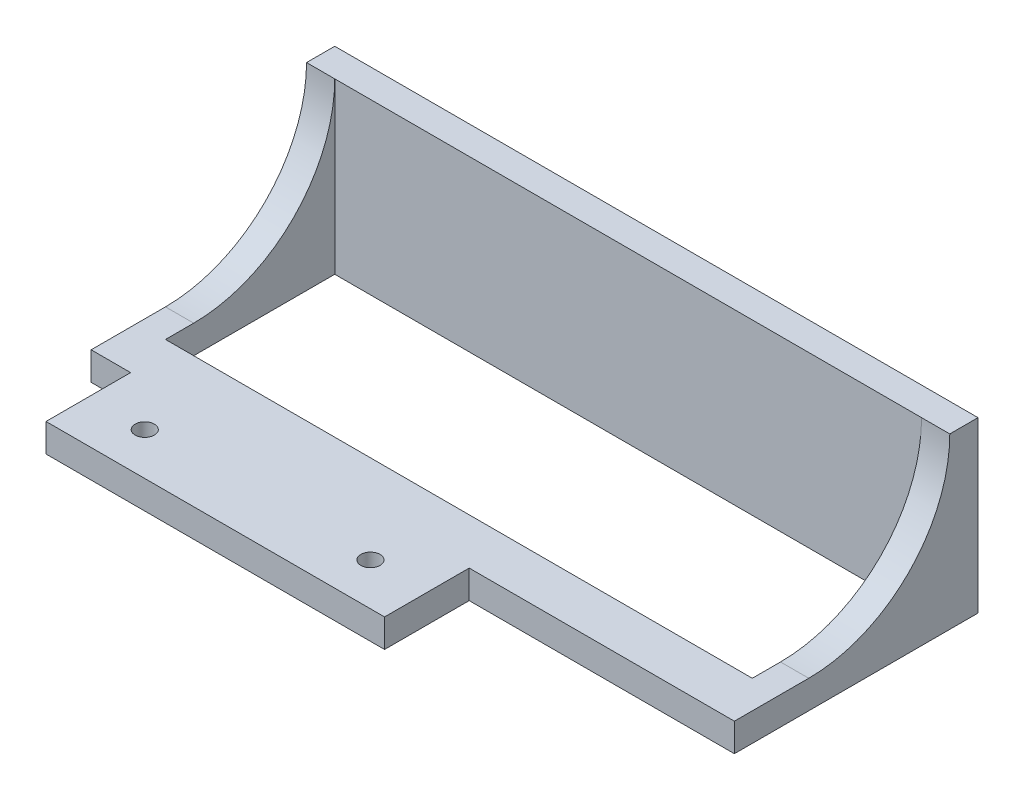
ISO-10303-21;
HEADER;
FILE_DESCRIPTION(('STEP AP214'),'2;1');
FILE_NAME('part.step','',(''),(''),'','','');
FILE_SCHEMA(('AUTOMOTIVE_DESIGN { 1 0 10303 214 1 1 1 1 }'));
ENDSEC;
DATA;
#1=APPLICATION_CONTEXT('core data for automotive mechanical design processes');
#2=APPLICATION_PROTOCOL_DEFINITION('international standard','automotive_design',2000,#1);
#3=PRODUCT_CONTEXT('',#1,'mechanical');
#4=PRODUCT('Part','Part','',(#3));
#5=PRODUCT_RELATED_PRODUCT_CATEGORY('part','',(#4));
#6=PRODUCT_DEFINITION_FORMATION('','',#4);
#7=PRODUCT_DEFINITION_CONTEXT('part definition',#1,'design');
#8=PRODUCT_DEFINITION('design','',#6,#7);
#9=PRODUCT_DEFINITION_SHAPE('','',#8);
#10=(LENGTH_UNIT() NAMED_UNIT(*) SI_UNIT(.MILLI.,.METRE.));
#11=(NAMED_UNIT(*) PLANE_ANGLE_UNIT() SI_UNIT($,.RADIAN.));
#12=(NAMED_UNIT(*) SI_UNIT($,.STERADIAN.) SOLID_ANGLE_UNIT());
#13=UNCERTAINTY_MEASURE_WITH_UNIT(LENGTH_MEASURE(1.E-05),#10,'distance_accuracy_value','');
#14=(GEOMETRIC_REPRESENTATION_CONTEXT(3) GLOBAL_UNCERTAINTY_ASSIGNED_CONTEXT((#13)) GLOBAL_UNIT_ASSIGNED_CONTEXT((#10,
#11,#12)) REPRESENTATION_CONTEXT('',''));
#15=CARTESIAN_POINT('',(0.,0.,0.));
#16=DIRECTION('',(0.,0.,1.));
#17=DIRECTION('',(1.,0.,0.));
#18=AXIS2_PLACEMENT_3D('',#15,#16,#17);
#19=CARTESIAN_POINT('',(7.00000000000001,5.,133.406020131956));
#20=DIRECTION('',(1.,0.,0.));
#21=DIRECTION('',(0.,0.,1.));
#22=AXIS2_PLACEMENT_3D('',#19,#20,#21);
#23=PLANE('',#22);
#24=DIRECTION('',(0.,0.,-1.));
#25=VECTOR('',#24,1.);
#26=CARTESIAN_POINT('',(7.00000000000001,0.,133.406020131956));
#27=LINE('',#26,#25);
#28=CARTESIAN_POINT('',(7.00000000000002,0.,124.878010065978));
#29=VERTEX_POINT('',#28);
#30=CARTESIAN_POINT('',(7.00000000000001,0.,109.878010065978));
#31=VERTEX_POINT('',#30);
#32=EDGE_CURVE('E222',#29,#31,#27,.T.);
#33=ORIENTED_EDGE('',*,*,#32,.F.);
#34=DIRECTION('',(0.,-1.,0.));
#35=VECTOR('',#34,1.);
#36=CARTESIAN_POINT('',(7.00000000000002,5.,124.878010065978));
#37=LINE('',#36,#35);
#38=CARTESIAN_POINT('',(7.00000000000002,5.,124.878010065978));
#39=VERTEX_POINT('',#38);
#40=EDGE_CURVE('E241',#39,#29,#37,.T.);
#41=ORIENTED_EDGE('',*,*,#40,.F.);
#42=DIRECTION('',(0.,0.,-1.));
#43=VECTOR('',#42,1.);
#44=CARTESIAN_POINT('',(7.00000000000001,5.,133.406020131956));
#45=LINE('',#44,#43);
#46=CARTESIAN_POINT('',(7.00000000000001,5.,109.878010065978));
#47=VERTEX_POINT('',#46);
#48=EDGE_CURVE('E184',#39,#47,#45,.T.);
#49=ORIENTED_EDGE('',*,*,#48,.T.);
#50=DIRECTION('',(0.,-1.,0.));
#51=VECTOR('',#50,1.);
#52=CARTESIAN_POINT('',(7.00000000000001,5.,109.878010065978));
#53=LINE('',#52,#51);
#54=EDGE_CURVE('E262',#47,#31,#53,.T.);
#55=ORIENTED_EDGE('',*,*,#54,.T.);
#56=EDGE_LOOP('',(#33,#41,#49,#55));
#57=FACE_BOUND('',#56,.T.);
#58=ADVANCED_FACE('F37',(#57),#23,.F.);
#59=CARTESIAN_POINT('',(0.,5.,109.878010065978));
#60=DIRECTION('',(0.,0.,-1.));
#61=DIRECTION('',(1.,0.,0.));
#62=AXIS2_PLACEMENT_3D('',#59,#60,#61);
#63=PLANE('',#62);
#64=DIRECTION('',(-1.,0.,0.));
#65=VECTOR('',#64,1.);
#66=CARTESIAN_POINT('',(0.,0.,109.878010065978));
#67=LINE('',#66,#65);
#68=CARTESIAN_POINT('',(0.,0.,109.878010065978));
#69=VERTEX_POINT('',#68);
#70=EDGE_CURVE('E225',#31,#69,#67,.T.);
#71=ORIENTED_EDGE('',*,*,#70,.F.);
#72=ORIENTED_EDGE('',*,*,#54,.F.);
#73=DIRECTION('',(-1.,0.,0.));
#74=VECTOR('',#73,1.);
#75=CARTESIAN_POINT('',(0.,5.,109.878010065978));
#76=LINE('',#75,#74);
#77=CARTESIAN_POINT('',(0.,5.,109.878010065978));
#78=VERTEX_POINT('',#77);
#79=EDGE_CURVE('E188',#47,#78,#76,.T.);
#80=ORIENTED_EDGE('',*,*,#79,.T.);
#81=DIRECTION('',(0.,-1.,0.));
#82=VECTOR('',#81,1.);
#83=CARTESIAN_POINT('',(0.,5.,109.878010065978));
#84=LINE('',#83,#82);
#85=EDGE_CURVE('E259',#78,#69,#84,.T.);
#86=ORIENTED_EDGE('',*,*,#85,.T.);
#87=EDGE_LOOP('',(#71,#72,#80,#86));
#88=FACE_BOUND('',#87,.T.);
#89=ADVANCED_FACE('F306',(#88),#63,.F.);
#90=CARTESIAN_POINT('',(0.,5.,133.406020131956));
#91=DIRECTION('',(-1.,0.,0.));
#92=DIRECTION('',(0.,0.,-1.));
#93=AXIS2_PLACEMENT_3D('',#90,#91,#92);
#94=PLANE('',#93);
#95=DIRECTION('',(0.,0.,1.));
#96=VECTOR('',#95,1.);
#97=CARTESIAN_POINT('',(0.,0.,133.406020131956));
#98=LINE('',#97,#96);
#99=CARTESIAN_POINT('',(0.,0.,66.7030100659778));
#100=VERTEX_POINT('',#99);
#101=EDGE_CURVE('E228',#100,#69,#98,.T.);
#102=ORIENTED_EDGE('',*,*,#101,.T.);
#103=ORIENTED_EDGE('',*,*,#85,.F.);
#104=DIRECTION('',(0.,0.,1.));
#105=VECTOR('',#104,1.);
#106=CARTESIAN_POINT('',(0.,5.,133.406020131956));
#107=LINE('',#106,#105);
#108=CARTESIAN_POINT('',(0.,5.,96.7030100659778));
#109=VERTEX_POINT('',#108);
#110=EDGE_CURVE('E168',#109,#78,#107,.T.);
#111=ORIENTED_EDGE('',*,*,#110,.F.);
#112=CARTESIAN_POINT('',(0.,30.,96.7030100659778));
#113=DIRECTION('',(1.,0.,0.));
#114=DIRECTION('',(0.,0.,-1.));
#115=AXIS2_PLACEMENT_3D('',#112,#113,#114);
#116=CIRCLE('',#115,25.);
#117=CARTESIAN_POINT('',(0.,30.,71.7030100659778));
#118=VERTEX_POINT('',#117);
#119=EDGE_CURVE('E146',#118,#109,#116,.F.);
#120=ORIENTED_EDGE('',*,*,#119,.F.);
#121=DIRECTION('',(0.,0.,-1.));
#122=VECTOR('',#121,1.);
#123=CARTESIAN_POINT('',(0.,30.,71.7030100659778));
#124=LINE('',#123,#122);
#125=CARTESIAN_POINT('',(0.,30.,66.7030100659778));
#126=VERTEX_POINT('',#125);
#127=EDGE_CURVE('E158',#118,#126,#124,.T.);
#128=ORIENTED_EDGE('',*,*,#127,.T.);
#129=DIRECTION('',(0.,-1.,0.));
#130=VECTOR('',#129,1.);
#131=CARTESIAN_POINT('',(0.,5.,66.7030100659778));
#132=LINE('',#131,#130);
#133=EDGE_CURVE('E257',#126,#100,#132,.T.);
#134=ORIENTED_EDGE('',*,*,#133,.T.);
#135=EDGE_LOOP('',(#102,#103,#111,#120,#128,#134));
#136=FACE_BOUND('',#135,.T.);
#137=ADVANCED_FACE('F166',(#136),#94,.T.);
#138=CARTESIAN_POINT('',(0.,5.,66.7030100659778));
#139=DIRECTION('',(0.,0.,-1.));
#140=DIRECTION('',(1.,0.,0.));
#141=AXIS2_PLACEMENT_3D('',#138,#139,#140);
#142=PLANE('',#141);
#143=DIRECTION('',(-1.,0.,0.));
#144=VECTOR('',#143,1.);
#145=CARTESIAN_POINT('',(0.,0.,66.7030100659778));
#146=LINE('',#145,#144);
#147=CARTESIAN_POINT('',(114.,0.,66.7030100659778));
#148=VERTEX_POINT('',#147);
#149=EDGE_CURVE('E230',#148,#100,#146,.T.);
#150=ORIENTED_EDGE('',*,*,#149,.T.);
#151=ORIENTED_EDGE('',*,*,#133,.F.);
#152=DIRECTION('',(1.,0.,0.));
#153=VECTOR('',#152,1.);
#154=CARTESIAN_POINT('',(0.,30.,66.7030100659778));
#155=LINE('',#154,#153);
#156=CARTESIAN_POINT('',(114.,30.,66.7030100659778));
#157=VERTEX_POINT('',#156);
#158=EDGE_CURVE('E161',#126,#157,#155,.T.);
#159=ORIENTED_EDGE('',*,*,#158,.T.);
#160=DIRECTION('',(0.,-1.,0.));
#161=VECTOR('',#160,1.);
#162=CARTESIAN_POINT('',(114.,5.,66.7030100659778));
#163=LINE('',#162,#161);
#164=EDGE_CURVE('E254',#157,#148,#163,.T.);
#165=ORIENTED_EDGE('',*,*,#164,.T.);
#166=EDGE_LOOP('',(#150,#151,#159,#165));
#167=FACE_BOUND('',#166,.T.);
#168=ADVANCED_FACE('F360',(#167),#142,.T.);
#169=CARTESIAN_POINT('',(114.,5.,133.406020131956));
#170=DIRECTION('',(1.,0.,0.));
#171=DIRECTION('',(0.,0.,1.));
#172=AXIS2_PLACEMENT_3D('',#169,#170,#171);
#173=PLANE('',#172);
#174=DIRECTION('',(0.,0.,-1.));
#175=VECTOR('',#174,1.);
#176=CARTESIAN_POINT('',(114.,0.,133.406020131956));
#177=LINE('',#176,#175);
#178=CARTESIAN_POINT('',(114.,0.,109.878010065978));
#179=VERTEX_POINT('',#178);
#180=EDGE_CURVE('E232',#179,#148,#177,.T.);
#181=ORIENTED_EDGE('',*,*,#180,.T.);
#182=ORIENTED_EDGE('',*,*,#164,.F.);
#183=DIRECTION('',(0.,0.,1.));
#184=VECTOR('',#183,1.);
#185=CARTESIAN_POINT('',(114.,30.,66.7030100659778));
#186=LINE('',#185,#184);
#187=CARTESIAN_POINT('',(114.,30.,71.7030100659778));
#188=VERTEX_POINT('',#187);
#189=EDGE_CURVE('E210',#157,#188,#186,.T.);
#190=ORIENTED_EDGE('',*,*,#189,.T.);
#191=CARTESIAN_POINT('',(114.,30.,96.7030100659778));
#192=DIRECTION('',(-1.,0.,0.));
#193=DIRECTION('',(0.,0.,1.));
#194=AXIS2_PLACEMENT_3D('',#191,#192,#193);
#195=CIRCLE('',#194,25.);
#196=CARTESIAN_POINT('',(114.,5.,96.7030100659778));
#197=VERTEX_POINT('',#196);
#198=EDGE_CURVE('E11',#197,#188,#195,.F.);
#199=ORIENTED_EDGE('',*,*,#198,.F.);
#200=DIRECTION('',(0.,0.,-1.));
#201=VECTOR('',#200,1.);
#202=CARTESIAN_POINT('',(114.,5.,133.406020131956));
#203=LINE('',#202,#201);
#204=CARTESIAN_POINT('',(114.,5.,109.878010065978));
#205=VERTEX_POINT('',#204);
#206=EDGE_CURVE('E197',#205,#197,#203,.T.);
#207=ORIENTED_EDGE('',*,*,#206,.F.);
#208=DIRECTION('',(0.,-1.,0.));
#209=VECTOR('',#208,1.);
#210=CARTESIAN_POINT('',(114.,5.,109.878010065978));
#211=LINE('',#210,#209);
#212=EDGE_CURVE('E251',#205,#179,#211,.T.);
#213=ORIENTED_EDGE('',*,*,#212,.T.);
#214=EDGE_LOOP('',(#181,#182,#190,#199,#207,#213));
#215=FACE_BOUND('',#214,.T.);
#216=ADVANCED_FACE('F356',(#215),#173,.T.);
#217=CARTESIAN_POINT('',(0.,5.,109.878010065978));
#218=DIRECTION('',(0.,0.,1.));
#219=DIRECTION('',(-1.,0.,0.));
#220=AXIS2_PLACEMENT_3D('',#217,#218,#219);
#221=PLANE('',#220);
#222=DIRECTION('',(1.,0.,0.));
#223=VECTOR('',#222,1.);
#224=CARTESIAN_POINT('',(0.,0.,109.878010065978));
#225=LINE('',#224,#223);
#226=CARTESIAN_POINT('',(67.,0.,109.878010065978));
#227=VERTEX_POINT('',#226);
#228=EDGE_CURVE('E234',#227,#179,#225,.T.);
#229=ORIENTED_EDGE('',*,*,#228,.T.);
#230=ORIENTED_EDGE('',*,*,#212,.F.);
#231=DIRECTION('',(1.,0.,0.));
#232=VECTOR('',#231,1.);
#233=CARTESIAN_POINT('',(0.,5.,109.878010065978));
#234=LINE('',#233,#232);
#235=CARTESIAN_POINT('',(67.,5.,109.878010065978));
#236=VERTEX_POINT('',#235);
#237=EDGE_CURVE('E199',#236,#205,#234,.T.);
#238=ORIENTED_EDGE('',*,*,#237,.F.);
#239=DIRECTION('',(0.,-1.,0.));
#240=VECTOR('',#239,1.);
#241=CARTESIAN_POINT('',(67.,5.,109.878010065978));
#242=LINE('',#241,#240);
#243=EDGE_CURVE('E248',#236,#227,#242,.T.);
#244=ORIENTED_EDGE('',*,*,#243,.T.);
#245=EDGE_LOOP('',(#229,#230,#238,#244));
#246=FACE_BOUND('',#245,.T.);
#247=ADVANCED_FACE('F352',(#246),#221,.T.);
#248=CARTESIAN_POINT('',(67.,5.,133.406020131956));
#249=DIRECTION('',(1.,0.,0.));
#250=DIRECTION('',(0.,0.,1.));
#251=AXIS2_PLACEMENT_3D('',#248,#249,#250);
#252=PLANE('',#251);
#253=DIRECTION('',(0.,0.,-1.));
#254=VECTOR('',#253,1.);
#255=CARTESIAN_POINT('',(67.,0.,133.406020131956));
#256=LINE('',#255,#254);
#257=CARTESIAN_POINT('',(67.,0.,124.878010065978));
#258=VERTEX_POINT('',#257);
#259=EDGE_CURVE('E236',#258,#227,#256,.T.);
#260=ORIENTED_EDGE('',*,*,#259,.T.);
#261=ORIENTED_EDGE('',*,*,#243,.F.);
#262=DIRECTION('',(0.,0.,-1.));
#263=VECTOR('',#262,1.);
#264=CARTESIAN_POINT('',(67.,5.,133.406020131956));
#265=LINE('',#264,#263);
#266=CARTESIAN_POINT('',(67.,5.,124.878010065978));
#267=VERTEX_POINT('',#266);
#268=EDGE_CURVE('E201',#267,#236,#265,.T.);
#269=ORIENTED_EDGE('',*,*,#268,.F.);
#270=DIRECTION('',(0.,-1.,0.));
#271=VECTOR('',#270,1.);
#272=CARTESIAN_POINT('',(67.,5.,124.878010065978));
#273=LINE('',#272,#271);
#274=EDGE_CURVE('E244',#267,#258,#273,.T.);
#275=ORIENTED_EDGE('',*,*,#274,.T.);
#276=EDGE_LOOP('',(#260,#261,#269,#275));
#277=FACE_BOUND('',#276,.T.);
#278=ADVANCED_FACE('F303',(#277),#252,.T.);
#279=CARTESIAN_POINT('',(5.00000000000002,5.,133.406020131956));
#280=DIRECTION('',(1.,0.,0.));
#281=DIRECTION('',(0.,0.,1.));
#282=AXIS2_PLACEMENT_3D('',#279,#280,#281);
#283=PLANE('',#282);
#284=DIRECTION('',(0.,0.,-1.));
#285=VECTOR('',#284,1.);
#286=CARTESIAN_POINT('',(5.00000000000002,0.,133.406020131956));
#287=LINE('',#286,#285);
#288=CARTESIAN_POINT('',(5.00000000000001,0.,101.703010065978));
#289=VERTEX_POINT('',#288);
#290=CARTESIAN_POINT('',(5.00000000000001,0.,71.7030100659778));
#291=VERTEX_POINT('',#290);
#292=EDGE_CURVE('E213',#289,#291,#287,.T.);
#293=ORIENTED_EDGE('',*,*,#292,.T.);
#294=DIRECTION('',(0.,-1.,0.));
#295=VECTOR('',#294,1.);
#296=CARTESIAN_POINT('',(5.00000000000001,5.,71.7030100659778));
#297=LINE('',#296,#295);
#298=CARTESIAN_POINT('',(5.00000000000001,30.,71.7030100659778));
#299=VERTEX_POINT('',#298);
#300=EDGE_CURVE('E205',#299,#291,#297,.T.);
#301=ORIENTED_EDGE('',*,*,#300,.F.);
#302=CARTESIAN_POINT('',(5.00000000000001,30.,96.7030100659778));
#303=DIRECTION('',(-1.,0.,0.));
#304=DIRECTION('',(0.,0.,1.));
#305=AXIS2_PLACEMENT_3D('',#302,#303,#304);
#306=CIRCLE('',#305,25.);
#307=CARTESIAN_POINT('',(5.00000000000001,5.,96.7030100659778));
#308=VERTEX_POINT('',#307);
#309=EDGE_CURVE('E149',#308,#299,#306,.F.);
#310=ORIENTED_EDGE('',*,*,#309,.F.);
#311=DIRECTION('',(0.,0.,-1.));
#312=VECTOR('',#311,1.);
#313=CARTESIAN_POINT('',(5.00000000000002,5.,133.406020131956));
#314=LINE('',#313,#312);
#315=CARTESIAN_POINT('',(5.00000000000001,5.,101.703010065978));
#316=VERTEX_POINT('',#315);
#317=EDGE_CURVE('E190',#316,#308,#314,.T.);
#318=ORIENTED_EDGE('',*,*,#317,.F.);
#319=DIRECTION('',(0.,-1.,0.));
#320=VECTOR('',#319,1.);
#321=CARTESIAN_POINT('',(5.00000000000001,5.,101.703010065978));
#322=LINE('',#321,#320);
#323=EDGE_CURVE('E245',#316,#289,#322,.T.);
#324=ORIENTED_EDGE('',*,*,#323,.T.);
#325=EDGE_LOOP('',(#293,#301,#310,#318,#324));
#326=FACE_BOUND('',#325,.T.);
#327=ADVANCED_FACE('F275',(#326),#283,.T.);
#328=CARTESIAN_POINT('',(0.,5.,101.703010065978));
#329=DIRECTION('',(0.,0.,-1.));
#330=DIRECTION('',(1.,0.,0.));
#331=AXIS2_PLACEMENT_3D('',#328,#329,#330);
#332=PLANE('',#331);
#333=DIRECTION('',(-1.,0.,0.));
#334=VECTOR('',#333,1.);
#335=CARTESIAN_POINT('',(0.,0.,101.703010065978));
#336=LINE('',#335,#334);
#337=CARTESIAN_POINT('',(109.,0.,101.703010065978));
#338=VERTEX_POINT('',#337);
#339=EDGE_CURVE('E216',#338,#289,#336,.T.);
#340=ORIENTED_EDGE('',*,*,#339,.T.);
#341=ORIENTED_EDGE('',*,*,#323,.F.);
#342=DIRECTION('',(-1.,0.,0.));
#343=VECTOR('',#342,1.);
#344=CARTESIAN_POINT('',(0.,5.,101.703010065978));
#345=LINE('',#344,#343);
#346=CARTESIAN_POINT('',(109.,5.,101.703010065978));
#347=VERTEX_POINT('',#346);
#348=EDGE_CURVE('E185',#347,#316,#345,.T.);
#349=ORIENTED_EDGE('',*,*,#348,.F.);
#350=DIRECTION('',(0.,-1.,0.));
#351=VECTOR('',#350,1.);
#352=CARTESIAN_POINT('',(109.,5.,101.703010065978));
#353=LINE('',#352,#351);
#354=EDGE_CURVE('E182',#347,#338,#353,.T.);
#355=ORIENTED_EDGE('',*,*,#354,.T.);
#356=EDGE_LOOP('',(#340,#341,#349,#355));
#357=FACE_BOUND('',#356,.T.);
#358=ADVANCED_FACE('F295',(#357),#332,.T.);
#359=CARTESIAN_POINT('',(109.,5.,133.406020131956));
#360=DIRECTION('',(-1.,0.,0.));
#361=DIRECTION('',(0.,0.,-1.));
#362=AXIS2_PLACEMENT_3D('',#359,#360,#361);
#363=PLANE('',#362);
#364=DIRECTION('',(0.,0.,1.));
#365=VECTOR('',#364,1.);
#366=CARTESIAN_POINT('',(109.,0.,133.406020131956));
#367=LINE('',#366,#365);
#368=CARTESIAN_POINT('',(109.,0.,71.7030100659778));
#369=VERTEX_POINT('',#368);
#370=EDGE_CURVE('E218',#369,#338,#367,.T.);
#371=ORIENTED_EDGE('',*,*,#370,.T.);
#372=ORIENTED_EDGE('',*,*,#354,.F.);
#373=DIRECTION('',(0.,0.,1.));
#374=VECTOR('',#373,1.);
#375=CARTESIAN_POINT('',(109.,5.,133.406020131956));
#376=LINE('',#375,#374);
#377=CARTESIAN_POINT('',(109.,5.,96.7030100659778));
#378=VERTEX_POINT('',#377);
#379=EDGE_CURVE('E179',#378,#347,#376,.T.);
#380=ORIENTED_EDGE('',*,*,#379,.F.);
#381=CARTESIAN_POINT('',(109.,30.,96.7030100659778));
#382=DIRECTION('',(1.,0.,0.));
#383=DIRECTION('',(0.,0.,-1.));
#384=AXIS2_PLACEMENT_3D('',#381,#382,#383);
#385=CIRCLE('',#384,25.);
#386=CARTESIAN_POINT('',(109.,30.,71.7030100659778));
#387=VERTEX_POINT('',#386);
#388=EDGE_CURVE('E45',#387,#378,#385,.F.);
#389=ORIENTED_EDGE('',*,*,#388,.F.);
#390=DIRECTION('',(0.,-1.,0.));
#391=VECTOR('',#390,1.);
#392=CARTESIAN_POINT('',(109.,5.,71.7030100659778));
#393=LINE('',#392,#391);
#394=EDGE_CURVE('E267',#387,#369,#393,.T.);
#395=ORIENTED_EDGE('',*,*,#394,.T.);
#396=EDGE_LOOP('',(#371,#372,#380,#389,#395));
#397=FACE_BOUND('',#396,.T.);
#398=ADVANCED_FACE('F180',(#397),#363,.T.);
#399=CARTESIAN_POINT('',(0.,5.,71.7030100659778));
#400=DIRECTION('',(0.,0.,1.));
#401=DIRECTION('',(-1.,0.,0.));
#402=AXIS2_PLACEMENT_3D('',#399,#400,#401);
#403=PLANE('',#402);
#404=ORIENTED_EDGE('',*,*,#300,.T.);
#405=DIRECTION('',(1.,0.,0.));
#406=VECTOR('',#405,1.);
#407=CARTESIAN_POINT('',(0.,0.,71.7030100659778));
#408=LINE('',#407,#406);
#409=EDGE_CURVE('E220',#291,#369,#408,.T.);
#410=ORIENTED_EDGE('',*,*,#409,.T.);
#411=ORIENTED_EDGE('',*,*,#394,.F.);
#412=DIRECTION('',(-1.,0.,0.));
#413=VECTOR('',#412,1.);
#414=CARTESIAN_POINT('',(114.,30.,71.7030100659778));
#415=LINE('',#414,#413);
#416=EDGE_CURVE('E154',#387,#299,#415,.T.);
#417=ORIENTED_EDGE('',*,*,#416,.T.);
#418=EDGE_LOOP('',(#404,#410,#411,#417));
#419=FACE_BOUND('',#418,.T.);
#420=ADVANCED_FACE('F284',(#419),#403,.T.);
#421=CARTESIAN_POINT('',(17.,5.,117.378010065978));
#422=DIRECTION('',(0.,-1.,0.));
#423=DIRECTION('',(0.,0.,1.));
#424=AXIS2_PLACEMENT_3D('',#421,#422,#423);
#425=CYLINDRICAL_SURFACE('',#424,1.7);
#426=CARTESIAN_POINT('',(17.,5.,117.378010065978));
#427=DIRECTION('',(0.,-1.,0.));
#428=DIRECTION('',(0.,0.,-1.));
#429=AXIS2_PLACEMENT_3D('',#426,#427,#428);
#430=CIRCLE('',#429,1.7);
#431=CARTESIAN_POINT('',(17.,5.,115.678010065978));
#432=VERTEX_POINT('',#431);
#433=EDGE_CURVE('E291',#432,#432,#430,.T.);
#434=ORIENTED_EDGE('',*,*,#433,.F.);
#435=EDGE_LOOP('',(#434));
#436=FACE_BOUND('',#435,.T.);
#437=CARTESIAN_POINT('',(17.,0.,117.378010065978));
#438=DIRECTION('',(0.,-1.,0.));
#439=DIRECTION('',(0.,0.,-1.));
#440=AXIS2_PLACEMENT_3D('',#437,#438,#439);
#441=CIRCLE('',#440,1.7);
#442=CARTESIAN_POINT('',(17.,0.,115.678010065978));
#443=VERTEX_POINT('',#442);
#444=EDGE_CURVE('E209',#443,#443,#441,.T.);
#445=ORIENTED_EDGE('',*,*,#444,.T.);
#446=EDGE_LOOP('',(#445));
#447=FACE_BOUND('',#446,.T.);
#448=ADVANCED_FACE('F318',(#436,#447),#425,.F.);
#449=CARTESIAN_POINT('',(57.,5.,117.378010065978));
#450=DIRECTION('',(0.,-1.,0.));
#451=DIRECTION('',(0.,0.,1.));
#452=AXIS2_PLACEMENT_3D('',#449,#450,#451);
#453=CYLINDRICAL_SURFACE('',#452,1.7);
#454=CARTESIAN_POINT('',(57.,5.,117.378010065978));
#455=DIRECTION('',(0.,-1.,0.));
#456=DIRECTION('',(0.,0.,-1.));
#457=AXIS2_PLACEMENT_3D('',#454,#455,#456);
#458=CIRCLE('',#457,1.7);
#459=CARTESIAN_POINT('',(57.,5.,115.678010065978));
#460=VERTEX_POINT('',#459);
#461=EDGE_CURVE('E240',#460,#460,#458,.T.);
#462=ORIENTED_EDGE('',*,*,#461,.F.);
#463=EDGE_LOOP('',(#462));
#464=FACE_BOUND('',#463,.T.);
#465=CARTESIAN_POINT('',(57.,0.,117.378010065978));
#466=DIRECTION('',(0.,-1.,0.));
#467=DIRECTION('',(0.,0.,-1.));
#468=AXIS2_PLACEMENT_3D('',#465,#466,#467);
#469=CIRCLE('',#468,1.7);
#470=CARTESIAN_POINT('',(57.,0.,115.678010065978));
#471=VERTEX_POINT('',#470);
#472=EDGE_CURVE('E206',#471,#471,#469,.T.);
#473=ORIENTED_EDGE('',*,*,#472,.T.);
#474=EDGE_LOOP('',(#473));
#475=FACE_BOUND('',#474,.T.);
#476=ADVANCED_FACE('F322',(#464,#475),#453,.F.);
#477=CARTESIAN_POINT('',(0.,5.,124.878010065978));
#478=DIRECTION('',(0.,0.,1.));
#479=DIRECTION('',(-1.,0.,0.));
#480=AXIS2_PLACEMENT_3D('',#477,#478,#479);
#481=PLANE('',#480);
#482=DIRECTION('',(1.,0.,0.));
#483=VECTOR('',#482,1.);
#484=CARTESIAN_POINT('',(0.,0.,124.878010065978));
#485=LINE('',#484,#483);
#486=EDGE_CURVE('E238',#29,#258,#485,.T.);
#487=ORIENTED_EDGE('',*,*,#486,.T.);
#488=ORIENTED_EDGE('',*,*,#274,.F.);
#489=DIRECTION('',(1.,0.,0.));
#490=VECTOR('',#489,1.);
#491=CARTESIAN_POINT('',(0.,5.,124.878010065978));
#492=LINE('',#491,#490);
#493=EDGE_CURVE('E203',#39,#267,#492,.T.);
#494=ORIENTED_EDGE('',*,*,#493,.F.);
#495=ORIENTED_EDGE('',*,*,#40,.T.);
#496=EDGE_LOOP('',(#487,#488,#494,#495));
#497=FACE_BOUND('',#496,.T.);
#498=ADVANCED_FACE('F328',(#497),#481,.T.);
#499=CARTESIAN_POINT('',(0.,5.,133.406020131956));
#500=DIRECTION('',(0.,1.,0.));
#501=DIRECTION('',(0.,0.,-1.));
#502=AXIS2_PLACEMENT_3D('',#499,#500,#501);
#503=PLANE('',#502);
#504=ORIENTED_EDGE('',*,*,#110,.T.);
#505=ORIENTED_EDGE('',*,*,#79,.F.);
#506=ORIENTED_EDGE('',*,*,#48,.F.);
#507=ORIENTED_EDGE('',*,*,#493,.T.);
#508=ORIENTED_EDGE('',*,*,#268,.T.);
#509=ORIENTED_EDGE('',*,*,#237,.T.);
#510=ORIENTED_EDGE('',*,*,#206,.T.);
#511=DIRECTION('',(-1.,0.,0.));
#512=VECTOR('',#511,1.);
#513=CARTESIAN_POINT('',(114.,5.,96.7030100659778));
#514=LINE('',#513,#512);
#515=EDGE_CURVE('E52',#378,#197,#514,.F.);
#516=ORIENTED_EDGE('',*,*,#515,.F.);
#517=ORIENTED_EDGE('',*,*,#379,.T.);
#518=ORIENTED_EDGE('',*,*,#348,.T.);
#519=ORIENTED_EDGE('',*,*,#317,.T.);
#520=DIRECTION('',(-1.,0.,0.));
#521=VECTOR('',#520,1.);
#522=CARTESIAN_POINT('',(5.00000000000002,5.,96.7030100659778));
#523=LINE('',#522,#521);
#524=EDGE_CURVE('E60',#109,#308,#523,.F.);
#525=ORIENTED_EDGE('',*,*,#524,.F.);
#526=EDGE_LOOP('',(#504,#505,#506,#507,#508,#509,#510,#516,#517,#518,#519,#525));
#527=FACE_BOUND('',#526,.T.);
#528=ORIENTED_EDGE('',*,*,#461,.T.);
#529=EDGE_LOOP('',(#528));
#530=FACE_BOUND('',#529,.T.);
#531=ORIENTED_EDGE('',*,*,#433,.T.);
#532=EDGE_LOOP('',(#531));
#533=FACE_BOUND('',#532,.T.);
#534=ADVANCED_FACE('F293',(#527,#530,#533),#503,.T.);
#535=CARTESIAN_POINT('',(0.,0.,133.406020131956));
#536=DIRECTION('',(0.,1.,0.));
#537=DIRECTION('',(0.,0.,-1.));
#538=AXIS2_PLACEMENT_3D('',#535,#536,#537);
#539=PLANE('',#538);
#540=ORIENTED_EDGE('',*,*,#472,.F.);
#541=EDGE_LOOP('',(#540));
#542=FACE_BOUND('',#541,.T.);
#543=ORIENTED_EDGE('',*,*,#444,.F.);
#544=EDGE_LOOP('',(#543));
#545=FACE_BOUND('',#544,.T.);
#546=ORIENTED_EDGE('',*,*,#292,.F.);
#547=ORIENTED_EDGE('',*,*,#339,.F.);
#548=ORIENTED_EDGE('',*,*,#370,.F.);
#549=ORIENTED_EDGE('',*,*,#409,.F.);
#550=EDGE_LOOP('',(#546,#547,#548,#549));
#551=FACE_BOUND('',#550,.T.);
#552=ORIENTED_EDGE('',*,*,#32,.T.);
#553=ORIENTED_EDGE('',*,*,#70,.T.);
#554=ORIENTED_EDGE('',*,*,#101,.F.);
#555=ORIENTED_EDGE('',*,*,#149,.F.);
#556=ORIENTED_EDGE('',*,*,#180,.F.);
#557=ORIENTED_EDGE('',*,*,#228,.F.);
#558=ORIENTED_EDGE('',*,*,#259,.F.);
#559=ORIENTED_EDGE('',*,*,#486,.F.);
#560=EDGE_LOOP('',(#552,#553,#554,#555,#556,#557,#558,#559));
#561=FACE_BOUND('',#560,.T.);
#562=ADVANCED_FACE('F279',(#542,#545,#551,#561),#539,.F.);
#563=CARTESIAN_POINT('',(0.,30.,133.406020131956));
#564=DIRECTION('',(0.,1.,0.));
#565=DIRECTION('',(0.,0.,-1.));
#566=AXIS2_PLACEMENT_3D('',#563,#564,#565);
#567=PLANE('',#566);
#568=EDGE_CURVE('E156',#188,#387,#415,.T.);
#569=ORIENTED_EDGE('',*,*,#568,.F.);
#570=ORIENTED_EDGE('',*,*,#189,.F.);
#571=ORIENTED_EDGE('',*,*,#158,.F.);
#572=ORIENTED_EDGE('',*,*,#127,.F.);
#573=EDGE_CURVE('E142',#299,#118,#415,.T.);
#574=ORIENTED_EDGE('',*,*,#573,.F.);
#575=ORIENTED_EDGE('',*,*,#416,.F.);
#576=EDGE_LOOP('',(#569,#570,#571,#572,#574,#575));
#577=FACE_BOUND('',#576,.T.);
#578=ADVANCED_FACE('F159',(#577),#567,.T.);
#579=CARTESIAN_POINT('',(0.,30.,96.7030100659778));
#580=DIRECTION('',(1.,0.,0.));
#581=DIRECTION('',(0.,0.,1.));
#582=AXIS2_PLACEMENT_3D('',#579,#580,#581);
#583=CYLINDRICAL_SURFACE('',#582,25.);
#584=ORIENTED_EDGE('',*,*,#309,.T.);
#585=ORIENTED_EDGE('',*,*,#573,.T.);
#586=ORIENTED_EDGE('',*,*,#119,.T.);
#587=ORIENTED_EDGE('',*,*,#524,.T.);
#588=EDGE_LOOP('',(#584,#585,#586,#587));
#589=FACE_BOUND('',#588,.T.);
#590=ADVANCED_FACE('F144',(#589),#583,.F.);
#591=CARTESIAN_POINT('',(0.,30.,96.7030100659778));
#592=DIRECTION('',(1.,0.,0.));
#593=DIRECTION('',(0.,0.,1.));
#594=AXIS2_PLACEMENT_3D('',#591,#592,#593);
#595=CYLINDRICAL_SURFACE('',#594,25.);
#596=ORIENTED_EDGE('',*,*,#198,.T.);
#597=ORIENTED_EDGE('',*,*,#568,.T.);
#598=ORIENTED_EDGE('',*,*,#388,.T.);
#599=ORIENTED_EDGE('',*,*,#515,.T.);
#600=EDGE_LOOP('',(#596,#597,#598,#599));
#601=FACE_BOUND('',#600,.T.);
#602=ADVANCED_FACE('F39',(#601),#595,.F.);
#603=CLOSED_SHELL('',(#58,#89,#137,#168,#216,#247,#278,#327,#358,#398,#420,#448,#476,#498,#534,
#562,#578,#590,#602));
#604=MANIFOLD_SOLID_BREP('B2',#603);
#605=ADVANCED_BREP_SHAPE_REPRESENTATION('',(#18,#604),#14);
#606=SHAPE_DEFINITION_REPRESENTATION(#9,#605);
ENDSEC;
END-ISO-10303-21;
